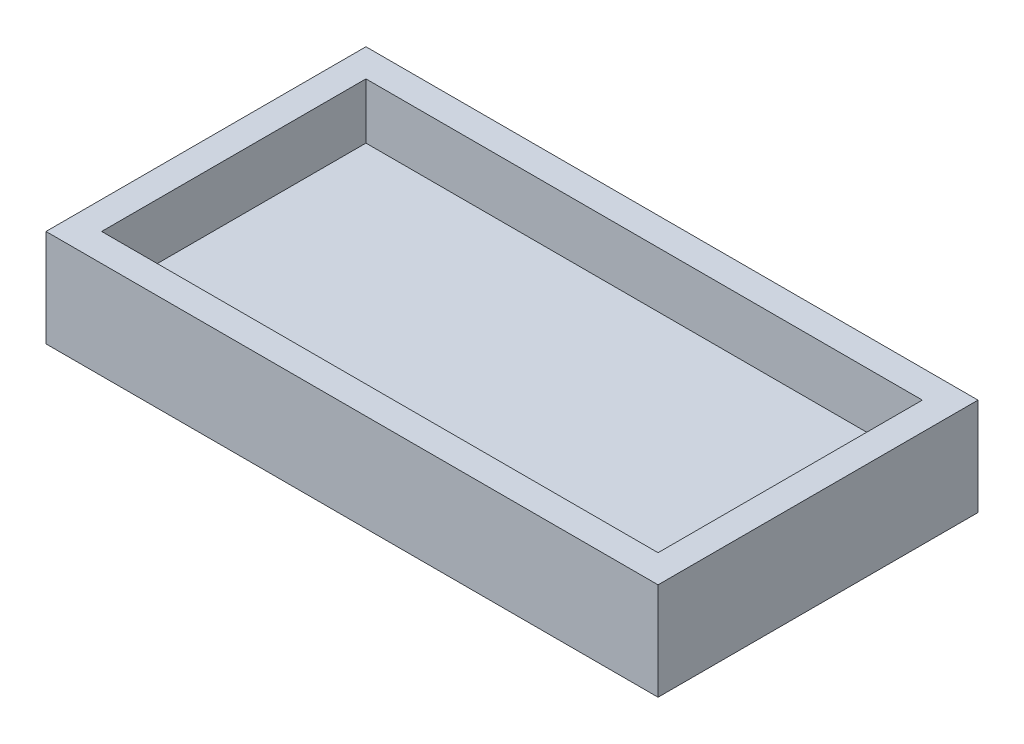
ISO-10303-21;
HEADER;
FILE_DESCRIPTION(('STEP AP214'),'2;1');
FILE_NAME('part.step','',(''),(''),'','','');
FILE_SCHEMA(('AUTOMOTIVE_DESIGN { 1 0 10303 214 1 1 1 1 }'));
ENDSEC;
DATA;
#1=APPLICATION_CONTEXT('core data for automotive mechanical design processes');
#2=APPLICATION_PROTOCOL_DEFINITION('international standard','automotive_design',2000,#1);
#3=PRODUCT_CONTEXT('',#1,'mechanical');
#4=PRODUCT('Part','Part','',(#3));
#5=PRODUCT_RELATED_PRODUCT_CATEGORY('part','',(#4));
#6=PRODUCT_DEFINITION_FORMATION('','',#4);
#7=PRODUCT_DEFINITION_CONTEXT('part definition',#1,'design');
#8=PRODUCT_DEFINITION('design','',#6,#7);
#9=PRODUCT_DEFINITION_SHAPE('','',#8);
#10=(LENGTH_UNIT() NAMED_UNIT(*) SI_UNIT(.MILLI.,.METRE.));
#11=(NAMED_UNIT(*) PLANE_ANGLE_UNIT() SI_UNIT($,.RADIAN.));
#12=(NAMED_UNIT(*) SI_UNIT($,.STERADIAN.) SOLID_ANGLE_UNIT());
#13=UNCERTAINTY_MEASURE_WITH_UNIT(LENGTH_MEASURE(1.E-05),#10,'distance_accuracy_value','');
#14=(GEOMETRIC_REPRESENTATION_CONTEXT(3) GLOBAL_UNCERTAINTY_ASSIGNED_CONTEXT((#13)) GLOBAL_UNIT_ASSIGNED_CONTEXT((#10,
#11,#12)) REPRESENTATION_CONTEXT('',''));
#15=CARTESIAN_POINT('',(0.,0.,0.));
#16=DIRECTION('',(0.,0.,1.));
#17=DIRECTION('',(1.,0.,0.));
#18=AXIS2_PLACEMENT_3D('',#15,#16,#17);
#19=CARTESIAN_POINT('',(0.,3.,0.));
#20=DIRECTION('',(0.,1.,0.));
#21=DIRECTION('',(0.,0.,1.));
#22=AXIS2_PLACEMENT_3D('',#19,#20,#21);
#23=PLANE('',#22);
#24=DIRECTION('',(0.,0.,-1.));
#25=VECTOR('',#24,1.);
#26=CARTESIAN_POINT('',(20.,3.,-9.5));
#27=LINE('',#26,#25);
#28=CARTESIAN_POINT('',(20.,3.,9.5));
#29=VERTEX_POINT('',#28);
#30=CARTESIAN_POINT('',(20.,3.,-9.5));
#31=VERTEX_POINT('',#30);
#32=EDGE_CURVE('E147',#29,#31,#27,.T.);
#33=ORIENTED_EDGE('',*,*,#32,.T.);
#34=DIRECTION('',(-1.,0.,0.));
#35=VECTOR('',#34,1.);
#36=CARTESIAN_POINT('',(-20.,3.,-9.5));
#37=LINE('',#36,#35);
#38=CARTESIAN_POINT('',(-20.,3.,-9.5));
#39=VERTEX_POINT('',#38);
#40=EDGE_CURVE('E60',#31,#39,#37,.T.);
#41=ORIENTED_EDGE('',*,*,#40,.T.);
#42=DIRECTION('',(0.,0.,1.));
#43=VECTOR('',#42,1.);
#44=CARTESIAN_POINT('',(-20.,3.,-9.5));
#45=LINE('',#44,#43);
#46=CARTESIAN_POINT('',(-20.,3.,9.5));
#47=VERTEX_POINT('',#46);
#48=EDGE_CURVE('E45',#39,#47,#45,.T.);
#49=ORIENTED_EDGE('',*,*,#48,.T.);
#50=DIRECTION('',(1.,0.,0.));
#51=VECTOR('',#50,1.);
#52=CARTESIAN_POINT('',(-20.,3.,9.5));
#53=LINE('',#52,#51);
#54=EDGE_CURVE('E12',#47,#29,#53,.T.);
#55=ORIENTED_EDGE('',*,*,#54,.T.);
#56=EDGE_LOOP('',(#33,#41,#49,#55));
#57=FACE_BOUND('',#56,.T.);
#58=ADVANCED_FACE('F37',(#57),#23,.T.);
#59=CARTESIAN_POINT('',(22.,60.6487663492256,-11.5));
#60=DIRECTION('',(0.,0.,-1.));
#61=DIRECTION('',(-1.,0.,0.));
#62=AXIS2_PLACEMENT_3D('',#59,#60,#61);
#63=PLANE('',#62);
#64=DIRECTION('',(0.,-1.,0.));
#65=VECTOR('',#64,1.);
#66=CARTESIAN_POINT('',(-22.,60.6487663492256,-11.5));
#67=LINE('',#66,#65);
#68=CARTESIAN_POINT('',(-22.,7.,-11.5));
#69=VERTEX_POINT('',#68);
#70=CARTESIAN_POINT('',(-22.,0.,-11.5));
#71=VERTEX_POINT('',#70);
#72=EDGE_CURVE('E115',#69,#71,#67,.T.);
#73=ORIENTED_EDGE('',*,*,#72,.F.);
#74=DIRECTION('',(1.,0.,0.));
#75=VECTOR('',#74,1.);
#76=CARTESIAN_POINT('',(22.,7.,-11.5));
#77=LINE('',#76,#75);
#78=CARTESIAN_POINT('',(22.,7.,-11.5));
#79=VERTEX_POINT('',#78);
#80=EDGE_CURVE('E148',#69,#79,#77,.T.);
#81=ORIENTED_EDGE('',*,*,#80,.T.);
#82=DIRECTION('',(0.,-1.,0.));
#83=VECTOR('',#82,1.);
#84=CARTESIAN_POINT('',(22.,60.6487663492256,-11.5));
#85=LINE('',#84,#83);
#86=CARTESIAN_POINT('',(22.,0.,-11.5));
#87=VERTEX_POINT('',#86);
#88=EDGE_CURVE('E129',#79,#87,#85,.T.);
#89=ORIENTED_EDGE('',*,*,#88,.T.);
#90=DIRECTION('',(1.,0.,0.));
#91=VECTOR('',#90,1.);
#92=CARTESIAN_POINT('',(22.,0.,-11.5));
#93=LINE('',#92,#91);
#94=EDGE_CURVE('E134',#71,#87,#93,.T.);
#95=ORIENTED_EDGE('',*,*,#94,.F.);
#96=EDGE_LOOP('',(#73,#81,#89,#95));
#97=FACE_BOUND('',#96,.T.);
#98=ADVANCED_FACE('F182',(#97),#63,.T.);
#99=CARTESIAN_POINT('',(-22.,60.6487663492256,-11.5));
#100=DIRECTION('',(-1.,0.,0.));
#101=DIRECTION('',(0.,0.,1.));
#102=AXIS2_PLACEMENT_3D('',#99,#100,#101);
#103=PLANE('',#102);
#104=DIRECTION('',(0.,-1.,0.));
#105=VECTOR('',#104,1.);
#106=CARTESIAN_POINT('',(-22.,60.6487663492256,11.5));
#107=LINE('',#106,#105);
#108=CARTESIAN_POINT('',(-22.,7.,11.5));
#109=VERTEX_POINT('',#108);
#110=CARTESIAN_POINT('',(-22.,0.,11.5));
#111=VERTEX_POINT('',#110);
#112=EDGE_CURVE('E114',#109,#111,#107,.T.);
#113=ORIENTED_EDGE('',*,*,#112,.F.);
#114=DIRECTION('',(0.,0.,-1.));
#115=VECTOR('',#114,1.);
#116=CARTESIAN_POINT('',(-22.,7.,-11.5));
#117=LINE('',#116,#115);
#118=EDGE_CURVE('E111',#109,#69,#117,.T.);
#119=ORIENTED_EDGE('',*,*,#118,.T.);
#120=ORIENTED_EDGE('',*,*,#72,.T.);
#121=DIRECTION('',(0.,0.,-1.));
#122=VECTOR('',#121,1.);
#123=CARTESIAN_POINT('',(-22.,0.,-11.5));
#124=LINE('',#123,#122);
#125=EDGE_CURVE('E143',#111,#71,#124,.T.);
#126=ORIENTED_EDGE('',*,*,#125,.F.);
#127=EDGE_LOOP('',(#113,#119,#120,#126));
#128=FACE_BOUND('',#127,.T.);
#129=ADVANCED_FACE('F186',(#128),#103,.T.);
#130=CARTESIAN_POINT('',(22.,60.6487663492256,11.5));
#131=DIRECTION('',(0.,0.,1.));
#132=DIRECTION('',(1.,0.,0.));
#133=AXIS2_PLACEMENT_3D('',#130,#131,#132);
#134=PLANE('',#133);
#135=DIRECTION('',(0.,-1.,0.));
#136=VECTOR('',#135,1.);
#137=CARTESIAN_POINT('',(22.,60.6487663492256,11.5));
#138=LINE('',#137,#136);
#139=CARTESIAN_POINT('',(22.,7.,11.5));
#140=VERTEX_POINT('',#139);
#141=CARTESIAN_POINT('',(22.,0.,11.5));
#142=VERTEX_POINT('',#141);
#143=EDGE_CURVE('E118',#140,#142,#138,.T.);
#144=ORIENTED_EDGE('',*,*,#143,.F.);
#145=DIRECTION('',(-1.,0.,0.));
#146=VECTOR('',#145,1.);
#147=CARTESIAN_POINT('',(22.,7.,11.5));
#148=LINE('',#147,#146);
#149=EDGE_CURVE('E103',#140,#109,#148,.T.);
#150=ORIENTED_EDGE('',*,*,#149,.T.);
#151=ORIENTED_EDGE('',*,*,#112,.T.);
#152=DIRECTION('',(-1.,0.,0.));
#153=VECTOR('',#152,1.);
#154=CARTESIAN_POINT('',(22.,0.,11.5));
#155=LINE('',#154,#153);
#156=EDGE_CURVE('E121',#142,#111,#155,.T.);
#157=ORIENTED_EDGE('',*,*,#156,.F.);
#158=EDGE_LOOP('',(#144,#150,#151,#157));
#159=FACE_BOUND('',#158,.T.);
#160=ADVANCED_FACE('F119',(#159),#134,.T.);
#161=CARTESIAN_POINT('',(22.,60.6487663492256,-11.5));
#162=DIRECTION('',(1.,0.,0.));
#163=DIRECTION('',(0.,0.,-1.));
#164=AXIS2_PLACEMENT_3D('',#161,#162,#163);
#165=PLANE('',#164);
#166=ORIENTED_EDGE('',*,*,#88,.F.);
#167=DIRECTION('',(0.,0.,1.));
#168=VECTOR('',#167,1.);
#169=CARTESIAN_POINT('',(22.,7.,-11.5));
#170=LINE('',#169,#168);
#171=EDGE_CURVE('E108',#79,#140,#170,.T.);
#172=ORIENTED_EDGE('',*,*,#171,.T.);
#173=ORIENTED_EDGE('',*,*,#143,.T.);
#174=DIRECTION('',(0.,0.,1.));
#175=VECTOR('',#174,1.);
#176=CARTESIAN_POINT('',(22.,0.,-11.5));
#177=LINE('',#176,#175);
#178=EDGE_CURVE('E270',#87,#142,#177,.T.);
#179=ORIENTED_EDGE('',*,*,#178,.F.);
#180=EDGE_LOOP('',(#166,#172,#173,#179));
#181=FACE_BOUND('',#180,.T.);
#182=ADVANCED_FACE('F128',(#181),#165,.T.);
#183=CARTESIAN_POINT('',(20.,60.6487663492256,-9.5));
#184=DIRECTION('',(1.,0.,0.));
#185=DIRECTION('',(0.,0.,-1.));
#186=AXIS2_PLACEMENT_3D('',#183,#184,#185);
#187=PLANE('',#186);
#188=ORIENTED_EDGE('',*,*,#32,.F.);
#189=DIRECTION('',(0.,-1.,0.));
#190=VECTOR('',#189,1.);
#191=CARTESIAN_POINT('',(20.,60.6487663492256,9.5));
#192=LINE('',#191,#190);
#193=CARTESIAN_POINT('',(20.,7.,9.5));
#194=VERTEX_POINT('',#193);
#195=EDGE_CURVE('E52',#194,#29,#192,.T.);
#196=ORIENTED_EDGE('',*,*,#195,.F.);
#197=DIRECTION('',(0.,0.,1.));
#198=VECTOR('',#197,1.);
#199=CARTESIAN_POINT('',(20.,7.,-9.5));
#200=LINE('',#199,#198);
#201=CARTESIAN_POINT('',(20.,7.,-9.5));
#202=VERTEX_POINT('',#201);
#203=EDGE_CURVE('E136',#202,#194,#200,.T.);
#204=ORIENTED_EDGE('',*,*,#203,.F.);
#205=DIRECTION('',(0.,-1.,0.));
#206=VECTOR('',#205,1.);
#207=CARTESIAN_POINT('',(20.,60.6487663492256,-9.5));
#208=LINE('',#207,#206);
#209=EDGE_CURVE('E125',#202,#31,#208,.T.);
#210=ORIENTED_EDGE('',*,*,#209,.T.);
#211=EDGE_LOOP('',(#188,#196,#204,#210));
#212=FACE_BOUND('',#211,.T.);
#213=ADVANCED_FACE('F189',(#212),#187,.F.);
#214=CARTESIAN_POINT('',(20.,60.6487663492256,-9.5));
#215=DIRECTION('',(0.,0.,-1.));
#216=DIRECTION('',(-1.,0.,0.));
#217=AXIS2_PLACEMENT_3D('',#214,#215,#216);
#218=PLANE('',#217);
#219=ORIENTED_EDGE('',*,*,#40,.F.);
#220=ORIENTED_EDGE('',*,*,#209,.F.);
#221=DIRECTION('',(1.,0.,0.));
#222=VECTOR('',#221,1.);
#223=CARTESIAN_POINT('',(20.,7.,-9.5));
#224=LINE('',#223,#222);
#225=CARTESIAN_POINT('',(-20.,7.,-9.5));
#226=VERTEX_POINT('',#225);
#227=EDGE_CURVE('E140',#226,#202,#224,.T.);
#228=ORIENTED_EDGE('',*,*,#227,.F.);
#229=DIRECTION('',(0.,-1.,0.));
#230=VECTOR('',#229,1.);
#231=CARTESIAN_POINT('',(-20.,60.6487663492256,-9.5));
#232=LINE('',#231,#230);
#233=EDGE_CURVE('E156',#226,#39,#232,.T.);
#234=ORIENTED_EDGE('',*,*,#233,.T.);
#235=EDGE_LOOP('',(#219,#220,#228,#234));
#236=FACE_BOUND('',#235,.T.);
#237=ADVANCED_FACE('F170',(#236),#218,.F.);
#238=CARTESIAN_POINT('',(-20.,60.6487663492256,-9.5));
#239=DIRECTION('',(-1.,0.,0.));
#240=DIRECTION('',(0.,0.,1.));
#241=AXIS2_PLACEMENT_3D('',#238,#239,#240);
#242=PLANE('',#241);
#243=ORIENTED_EDGE('',*,*,#48,.F.);
#244=ORIENTED_EDGE('',*,*,#233,.F.);
#245=DIRECTION('',(0.,0.,-1.));
#246=VECTOR('',#245,1.);
#247=CARTESIAN_POINT('',(-20.,7.,-9.5));
#248=LINE('',#247,#246);
#249=CARTESIAN_POINT('',(-20.,7.,9.5));
#250=VERTEX_POINT('',#249);
#251=EDGE_CURVE('E144',#250,#226,#248,.T.);
#252=ORIENTED_EDGE('',*,*,#251,.F.);
#253=DIRECTION('',(0.,-1.,0.));
#254=VECTOR('',#253,1.);
#255=CARTESIAN_POINT('',(-20.,60.6487663492256,9.5));
#256=LINE('',#255,#254);
#257=EDGE_CURVE('E158',#250,#47,#256,.T.);
#258=ORIENTED_EDGE('',*,*,#257,.T.);
#259=EDGE_LOOP('',(#243,#244,#252,#258));
#260=FACE_BOUND('',#259,.T.);
#261=ADVANCED_FACE('F168',(#260),#242,.F.);
#262=CARTESIAN_POINT('',(20.,60.6487663492256,9.5));
#263=DIRECTION('',(0.,0.,1.));
#264=DIRECTION('',(1.,0.,0.));
#265=AXIS2_PLACEMENT_3D('',#262,#263,#264);
#266=PLANE('',#265);
#267=ORIENTED_EDGE('',*,*,#54,.F.);
#268=ORIENTED_EDGE('',*,*,#257,.F.);
#269=DIRECTION('',(-1.,0.,0.));
#270=VECTOR('',#269,1.);
#271=CARTESIAN_POINT('',(20.,7.,9.5));
#272=LINE('',#271,#270);
#273=EDGE_CURVE('E139',#194,#250,#272,.T.);
#274=ORIENTED_EDGE('',*,*,#273,.F.);
#275=ORIENTED_EDGE('',*,*,#195,.T.);
#276=EDGE_LOOP('',(#267,#268,#274,#275));
#277=FACE_BOUND('',#276,.T.);
#278=ADVANCED_FACE('F171',(#277),#266,.F.);
#279=CARTESIAN_POINT('',(0.,7.,0.));
#280=DIRECTION('',(0.,1.,0.));
#281=DIRECTION('',(0.,0.,1.));
#282=AXIS2_PLACEMENT_3D('',#279,#280,#281);
#283=PLANE('',#282);
#284=ORIENTED_EDGE('',*,*,#80,.F.);
#285=ORIENTED_EDGE('',*,*,#118,.F.);
#286=ORIENTED_EDGE('',*,*,#149,.F.);
#287=ORIENTED_EDGE('',*,*,#171,.F.);
#288=EDGE_LOOP('',(#284,#285,#286,#287));
#289=FACE_BOUND('',#288,.T.);
#290=ORIENTED_EDGE('',*,*,#227,.T.);
#291=ORIENTED_EDGE('',*,*,#203,.T.);
#292=ORIENTED_EDGE('',*,*,#273,.T.);
#293=ORIENTED_EDGE('',*,*,#251,.T.);
#294=EDGE_LOOP('',(#290,#291,#292,#293));
#295=FACE_BOUND('',#294,.T.);
#296=ADVANCED_FACE('F105',(#289,#295),#283,.T.);
#297=CARTESIAN_POINT('',(0.,0.,0.));
#298=DIRECTION('',(0.,1.,0.));
#299=DIRECTION('',(0.,0.,1.));
#300=AXIS2_PLACEMENT_3D('',#297,#298,#299);
#301=PLANE('',#300);
#302=ORIENTED_EDGE('',*,*,#94,.T.);
#303=ORIENTED_EDGE('',*,*,#178,.T.);
#304=ORIENTED_EDGE('',*,*,#156,.T.);
#305=ORIENTED_EDGE('',*,*,#125,.T.);
#306=EDGE_LOOP('',(#302,#303,#304,#305));
#307=FACE_BOUND('',#306,.T.);
#308=ADVANCED_FACE('F39',(#307),#301,.F.);
#309=CLOSED_SHELL('',(#58,#98,#129,#160,#182,#213,#237,#261,#278,#296,#308));
#310=MANIFOLD_SOLID_BREP('B2',#309);
#311=ADVANCED_BREP_SHAPE_REPRESENTATION('',(#18,#310),#14);
#312=SHAPE_DEFINITION_REPRESENTATION(#9,#311);
ENDSEC;
END-ISO-10303-21;
